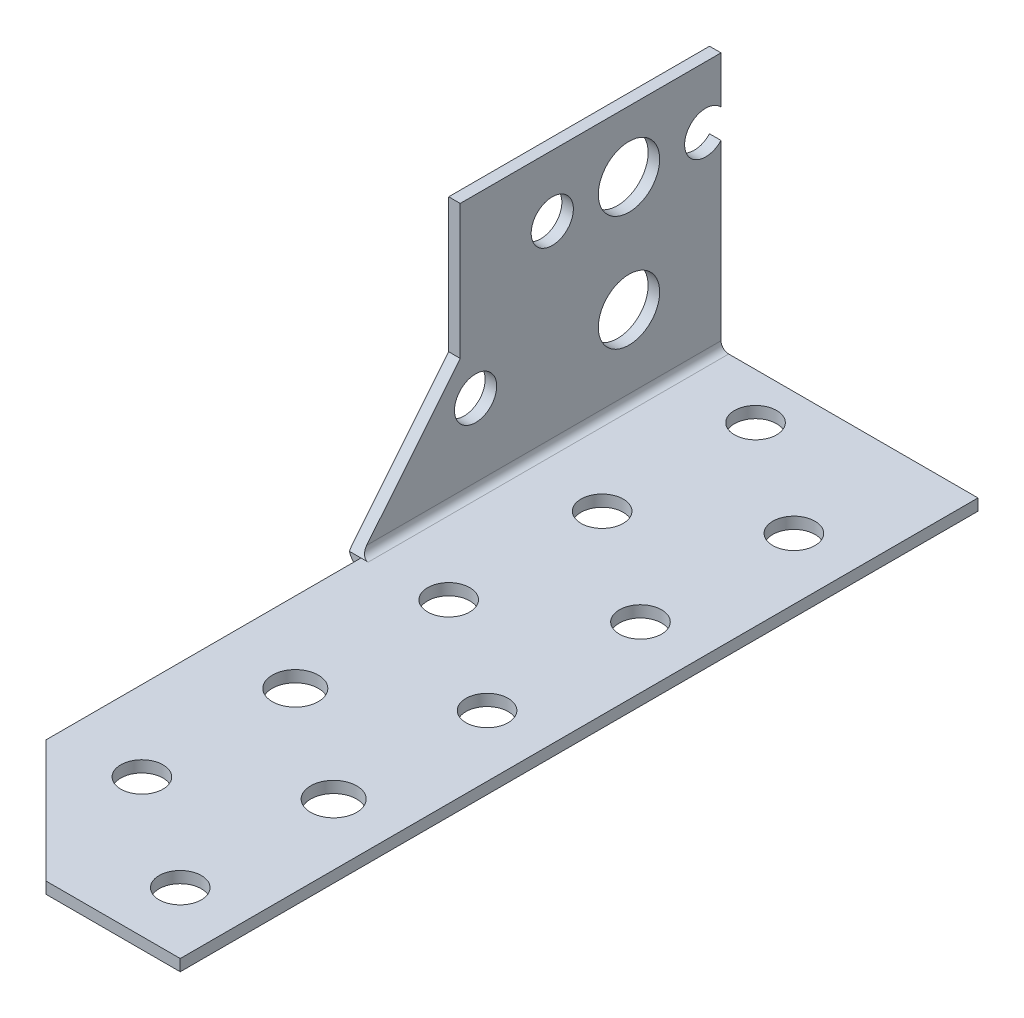
ISO-10303-21;
HEADER;
FILE_DESCRIPTION(('STEP AP214'),'2;1');
FILE_NAME('part.step','',(''),(''),'','','');
FILE_SCHEMA(('AUTOMOTIVE_DESIGN { 1 0 10303 214 1 1 1 1 }'));
ENDSEC;
DATA;
#1=APPLICATION_CONTEXT('core data for automotive mechanical design processes');
#2=APPLICATION_PROTOCOL_DEFINITION('international standard','automotive_design',2000,#1);
#3=PRODUCT_CONTEXT('',#1,'mechanical');
#4=PRODUCT('Part','Part','',(#3));
#5=PRODUCT_RELATED_PRODUCT_CATEGORY('part','',(#4));
#6=PRODUCT_DEFINITION_FORMATION('','',#4);
#7=PRODUCT_DEFINITION_CONTEXT('part definition',#1,'design');
#8=PRODUCT_DEFINITION('design','',#6,#7);
#9=PRODUCT_DEFINITION_SHAPE('','',#8);
#10=(LENGTH_UNIT() NAMED_UNIT(*) SI_UNIT(.MILLI.,.METRE.));
#11=(NAMED_UNIT(*) PLANE_ANGLE_UNIT() SI_UNIT($,.RADIAN.));
#12=(NAMED_UNIT(*) SI_UNIT($,.STERADIAN.) SOLID_ANGLE_UNIT());
#13=UNCERTAINTY_MEASURE_WITH_UNIT(LENGTH_MEASURE(1.E-05),#10,'distance_accuracy_value','');
#14=(GEOMETRIC_REPRESENTATION_CONTEXT(3) GLOBAL_UNCERTAINTY_ASSIGNED_CONTEXT((#13)) GLOBAL_UNIT_ASSIGNED_CONTEXT((#10,
#11,#12)) REPRESENTATION_CONTEXT('',''));
#15=CARTESIAN_POINT('',(0.,0.,0.));
#16=DIRECTION('',(0.,0.,1.));
#17=DIRECTION('',(1.,0.,0.));
#18=AXIS2_PLACEMENT_3D('',#15,#16,#17);
#19=CARTESIAN_POINT('',(0.,0.,210.));
#20=DIRECTION('',(0.,0.,1.));
#21=DIRECTION('',(1.,0.,0.));
#22=AXIS2_PLACEMENT_3D('',#19,#20,#21);
#23=PLANE('',#22);
#24=DIRECTION('',(0.,1.,0.));
#25=VECTOR('',#24,1.);
#26=CARTESIAN_POINT('',(16.75,0.,210.));
#27=LINE('',#26,#25);
#28=CARTESIAN_POINT('',(16.75,-17.5,210.));
#29=VERTEX_POINT('',#28);
#30=CARTESIAN_POINT('',(16.75,-16.,210.));
#31=VERTEX_POINT('',#30);
#32=EDGE_CURVE('E193',#29,#31,#27,.T.);
#33=ORIENTED_EDGE('',*,*,#32,.F.);
#34=DIRECTION('',(1.,0.,0.));
#35=VECTOR('',#34,1.);
#36=CARTESIAN_POINT('',(0.,-17.5,210.));
#37=LINE('',#36,#35);
#38=CARTESIAN_POINT('',(34.25,-17.5,210.));
#39=VERTEX_POINT('',#38);
#40=EDGE_CURVE('E411',#29,#39,#37,.T.);
#41=ORIENTED_EDGE('',*,*,#40,.T.);
#42=DIRECTION('',(0.,1.,0.));
#43=VECTOR('',#42,1.);
#44=CARTESIAN_POINT('',(34.2500000000001,-1.58438077472549E-13,210.));
#45=LINE('',#44,#43);
#46=CARTESIAN_POINT('',(34.25,-16.,210.));
#47=VERTEX_POINT('',#46);
#48=EDGE_CURVE('E414',#39,#47,#45,.T.);
#49=ORIENTED_EDGE('',*,*,#48,.T.);
#50=DIRECTION('',(1.,0.,0.));
#51=VECTOR('',#50,1.);
#52=CARTESIAN_POINT('',(0.,-16.,210.));
#53=LINE('',#52,#51);
#54=EDGE_CURVE('E176',#31,#47,#53,.T.);
#55=ORIENTED_EDGE('',*,*,#54,.F.);
#56=EDGE_LOOP('',(#33,#41,#49,#55));
#57=FACE_BOUND('',#56,.T.);
#58=ADVANCED_FACE('F46',(#57),#23,.T.);
#59=CARTESIAN_POINT('',(26.25,-21.,202.));
#60=DIRECTION('',(0.,1.,0.));
#61=DIRECTION('',(0.,0.,1.));
#62=AXIS2_PLACEMENT_3D('',#59,#60,#61);
#63=CYLINDRICAL_SURFACE('',#62,2.75000000000002);
#64=CARTESIAN_POINT('',(26.25,-16.,202.));
#65=DIRECTION('',(0.,1.,0.));
#66=DIRECTION('',(0.,0.,1.));
#67=AXIS2_PLACEMENT_3D('',#64,#65,#66);
#68=CIRCLE('',#67,2.75000000000002);
#69=CARTESIAN_POINT('',(26.25,-16.,204.75));
#70=VERTEX_POINT('',#69);
#71=EDGE_CURVE('E279',#70,#70,#68,.T.);
#72=ORIENTED_EDGE('',*,*,#71,.T.);
#73=EDGE_LOOP('',(#72));
#74=FACE_BOUND('',#73,.T.);
#75=CARTESIAN_POINT('',(26.25,-17.5,202.));
#76=DIRECTION('',(0.,1.,0.));
#77=DIRECTION('',(0.,0.,1.));
#78=AXIS2_PLACEMENT_3D('',#75,#76,#77);
#79=CIRCLE('',#78,2.75000000000002);
#80=CARTESIAN_POINT('',(26.25,-17.5,204.75));
#81=VERTEX_POINT('',#80);
#82=EDGE_CURVE('E339',#81,#81,#79,.T.);
#83=ORIENTED_EDGE('',*,*,#82,.F.);
#84=EDGE_LOOP('',(#83));
#85=FACE_BOUND('',#84,.T.);
#86=ADVANCED_FACE('F482',(#74,#85),#63,.F.);
#87=CARTESIAN_POINT('',(26.25,-21.,162.));
#88=DIRECTION('',(0.,1.,0.));
#89=DIRECTION('',(0.,0.,1.));
#90=AXIS2_PLACEMENT_3D('',#87,#88,#89);
#91=CYLINDRICAL_SURFACE('',#90,2.75000000000002);
#92=CARTESIAN_POINT('',(26.25,-16.,162.));
#93=DIRECTION('',(0.,1.,0.));
#94=DIRECTION('',(0.,0.,1.));
#95=AXIS2_PLACEMENT_3D('',#92,#93,#94);
#96=CIRCLE('',#95,2.75000000000002);
#97=CARTESIAN_POINT('',(26.25,-16.,164.75));
#98=VERTEX_POINT('',#97);
#99=EDGE_CURVE('E289',#98,#98,#96,.T.);
#100=ORIENTED_EDGE('',*,*,#99,.T.);
#101=EDGE_LOOP('',(#100));
#102=FACE_BOUND('',#101,.T.);
#103=CARTESIAN_POINT('',(26.25,-17.5,162.));
#104=DIRECTION('',(0.,1.,0.));
#105=DIRECTION('',(0.,0.,1.));
#106=AXIS2_PLACEMENT_3D('',#103,#104,#105);
#107=CIRCLE('',#106,2.75000000000002);
#108=CARTESIAN_POINT('',(26.25,-17.5,164.75));
#109=VERTEX_POINT('',#108);
#110=EDGE_CURVE('E335',#109,#109,#107,.T.);
#111=ORIENTED_EDGE('',*,*,#110,.F.);
#112=EDGE_LOOP('',(#111));
#113=FACE_BOUND('',#112,.T.);
#114=ADVANCED_FACE('F488',(#102,#113),#91,.F.);
#115=CARTESIAN_POINT('',(26.25,-21.,142.));
#116=DIRECTION('',(0.,1.,0.));
#117=DIRECTION('',(0.,0.,1.));
#118=AXIS2_PLACEMENT_3D('',#115,#116,#117);
#119=CYLINDRICAL_SURFACE('',#118,2.75000000000001);
#120=CARTESIAN_POINT('',(26.25,-16.,142.));
#121=DIRECTION('',(0.,1.,0.));
#122=DIRECTION('',(0.,0.,1.));
#123=AXIS2_PLACEMENT_3D('',#120,#121,#122);
#124=CIRCLE('',#123,2.75000000000001);
#125=CARTESIAN_POINT('',(26.25,-16.,144.75));
#126=VERTEX_POINT('',#125);
#127=EDGE_CURVE('E285',#126,#126,#124,.T.);
#128=ORIENTED_EDGE('',*,*,#127,.T.);
#129=EDGE_LOOP('',(#128));
#130=FACE_BOUND('',#129,.T.);
#131=CARTESIAN_POINT('',(26.25,-17.5,142.));
#132=DIRECTION('',(0.,1.,0.));
#133=DIRECTION('',(0.,0.,1.));
#134=AXIS2_PLACEMENT_3D('',#131,#132,#133);
#135=CIRCLE('',#134,2.75000000000001);
#136=CARTESIAN_POINT('',(26.25,-17.5,144.75));
#137=VERTEX_POINT('',#136);
#138=EDGE_CURVE('E331',#137,#137,#135,.T.);
#139=ORIENTED_EDGE('',*,*,#138,.F.);
#140=EDGE_LOOP('',(#139));
#141=FACE_BOUND('',#140,.T.);
#142=ADVANCED_FACE('F605',(#130,#141),#119,.F.);
#143=CARTESIAN_POINT('',(26.25,-21.,122.));
#144=DIRECTION('',(0.,1.,0.));
#145=DIRECTION('',(0.,0.,1.));
#146=AXIS2_PLACEMENT_3D('',#143,#144,#145);
#147=CYLINDRICAL_SURFACE('',#146,2.74999999999999);
#148=CARTESIAN_POINT('',(26.25,-16.,122.));
#149=DIRECTION('',(0.,1.,0.));
#150=DIRECTION('',(0.,0.,1.));
#151=AXIS2_PLACEMENT_3D('',#148,#149,#150);
#152=CIRCLE('',#151,2.74999999999999);
#153=CARTESIAN_POINT('',(26.25,-16.,124.75));
#154=VERTEX_POINT('',#153);
#155=EDGE_CURVE('E280',#154,#154,#152,.T.);
#156=ORIENTED_EDGE('',*,*,#155,.T.);
#157=EDGE_LOOP('',(#156));
#158=FACE_BOUND('',#157,.T.);
#159=CARTESIAN_POINT('',(26.25,-17.5,122.));
#160=DIRECTION('',(0.,1.,0.));
#161=DIRECTION('',(0.,0.,1.));
#162=AXIS2_PLACEMENT_3D('',#159,#160,#161);
#163=CIRCLE('',#162,2.74999999999999);
#164=CARTESIAN_POINT('',(26.25,-17.5,124.75));
#165=VERTEX_POINT('',#164);
#166=EDGE_CURVE('E327',#165,#165,#163,.T.);
#167=ORIENTED_EDGE('',*,*,#166,.F.);
#168=EDGE_LOOP('',(#167));
#169=FACE_BOUND('',#168,.T.);
#170=ADVANCED_FACE('F578',(#158,#169),#147,.F.);
#171=CARTESIAN_POINT('',(11.25,-21.,112.));
#172=DIRECTION('',(0.,1.,0.));
#173=DIRECTION('',(0.,0.,1.));
#174=AXIS2_PLACEMENT_3D('',#171,#172,#173);
#175=CYLINDRICAL_SURFACE('',#174,2.74999999999997);
#176=CARTESIAN_POINT('',(11.25,-16.,112.));
#177=DIRECTION('',(0.,1.,0.));
#178=DIRECTION('',(0.,0.,1.));
#179=AXIS2_PLACEMENT_3D('',#176,#177,#178);
#180=CIRCLE('',#179,2.74999999999997);
#181=CARTESIAN_POINT('',(11.25,-16.,114.75));
#182=VERTEX_POINT('',#181);
#183=EDGE_CURVE('E300',#182,#182,#180,.T.);
#184=ORIENTED_EDGE('',*,*,#183,.T.);
#185=EDGE_LOOP('',(#184));
#186=FACE_BOUND('',#185,.T.);
#187=CARTESIAN_POINT('',(11.25,-17.5,112.));
#188=DIRECTION('',(0.,1.,0.));
#189=DIRECTION('',(0.,0.,1.));
#190=AXIS2_PLACEMENT_3D('',#187,#188,#189);
#191=CIRCLE('',#190,2.74999999999997);
#192=CARTESIAN_POINT('',(11.25,-17.5,114.75));
#193=VERTEX_POINT('',#192);
#194=EDGE_CURVE('E323',#193,#193,#191,.T.);
#195=ORIENTED_EDGE('',*,*,#194,.F.);
#196=EDGE_LOOP('',(#195));
#197=FACE_BOUND('',#196,.T.);
#198=ADVANCED_FACE('F573',(#186,#197),#175,.F.);
#199=CARTESIAN_POINT('',(11.25,-21.,132.));
#200=DIRECTION('',(0.,1.,0.));
#201=DIRECTION('',(0.,0.,1.));
#202=AXIS2_PLACEMENT_3D('',#199,#200,#201);
#203=CYLINDRICAL_SURFACE('',#202,2.75000000000001);
#204=CARTESIAN_POINT('',(11.25,-16.,132.));
#205=DIRECTION('',(0.,1.,0.));
#206=DIRECTION('',(0.,0.,1.));
#207=AXIS2_PLACEMENT_3D('',#204,#205,#206);
#208=CIRCLE('',#207,2.75000000000001);
#209=CARTESIAN_POINT('',(11.25,-16.,134.75));
#210=VERTEX_POINT('',#209);
#211=EDGE_CURVE('E305',#210,#210,#208,.T.);
#212=ORIENTED_EDGE('',*,*,#211,.T.);
#213=EDGE_LOOP('',(#212));
#214=FACE_BOUND('',#213,.T.);
#215=CARTESIAN_POINT('',(11.25,-17.5,132.));
#216=DIRECTION('',(0.,1.,0.));
#217=DIRECTION('',(0.,0.,1.));
#218=AXIS2_PLACEMENT_3D('',#215,#216,#217);
#219=CIRCLE('',#218,2.75000000000001);
#220=CARTESIAN_POINT('',(11.25,-17.5,134.75));
#221=VERTEX_POINT('',#220);
#222=EDGE_CURVE('E319',#221,#221,#219,.T.);
#223=ORIENTED_EDGE('',*,*,#222,.F.);
#224=EDGE_LOOP('',(#223));
#225=FACE_BOUND('',#224,.T.);
#226=ADVANCED_FACE('F577',(#214,#225),#203,.F.);
#227=CARTESIAN_POINT('',(11.25,-21.,152.));
#228=DIRECTION('',(0.,1.,0.));
#229=DIRECTION('',(0.,0.,1.));
#230=AXIS2_PLACEMENT_3D('',#227,#228,#229);
#231=CYLINDRICAL_SURFACE('',#230,2.75000000000001);
#232=CARTESIAN_POINT('',(11.25,-16.,152.));
#233=DIRECTION('',(0.,1.,0.));
#234=DIRECTION('',(0.,0.,1.));
#235=AXIS2_PLACEMENT_3D('',#232,#233,#234);
#236=CIRCLE('',#235,2.75000000000001);
#237=CARTESIAN_POINT('',(11.25,-16.,154.75));
#238=VERTEX_POINT('',#237);
#239=EDGE_CURVE('E299',#238,#238,#236,.T.);
#240=ORIENTED_EDGE('',*,*,#239,.T.);
#241=EDGE_LOOP('',(#240));
#242=FACE_BOUND('',#241,.T.);
#243=CARTESIAN_POINT('',(11.25,-17.5,152.));
#244=DIRECTION('',(0.,1.,0.));
#245=DIRECTION('',(0.,0.,1.));
#246=AXIS2_PLACEMENT_3D('',#243,#244,#245);
#247=CIRCLE('',#246,2.75000000000001);
#248=CARTESIAN_POINT('',(11.25,-17.5,154.75));
#249=VERTEX_POINT('',#248);
#250=EDGE_CURVE('E315',#249,#249,#247,.T.);
#251=ORIENTED_EDGE('',*,*,#250,.F.);
#252=EDGE_LOOP('',(#251));
#253=FACE_BOUND('',#252,.T.);
#254=ADVANCED_FACE('F565',(#242,#253),#231,.F.);
#255=CARTESIAN_POINT('',(11.25,-21.,192.));
#256=DIRECTION('',(0.,1.,0.));
#257=DIRECTION('',(0.,0.,1.));
#258=AXIS2_PLACEMENT_3D('',#255,#256,#257);
#259=CYLINDRICAL_SURFACE('',#258,2.75000000000002);
#260=CARTESIAN_POINT('',(11.25,-16.,192.));
#261=DIRECTION('',(0.,1.,0.));
#262=DIRECTION('',(0.,0.,1.));
#263=AXIS2_PLACEMENT_3D('',#260,#261,#262);
#264=CIRCLE('',#263,2.75000000000002);
#265=CARTESIAN_POINT('',(11.25,-16.,194.75));
#266=VERTEX_POINT('',#265);
#267=EDGE_CURVE('E284',#266,#266,#264,.T.);
#268=ORIENTED_EDGE('',*,*,#267,.T.);
#269=EDGE_LOOP('',(#268));
#270=FACE_BOUND('',#269,.T.);
#271=CARTESIAN_POINT('',(11.25,-17.5,192.));
#272=DIRECTION('',(0.,1.,0.));
#273=DIRECTION('',(0.,0.,1.));
#274=AXIS2_PLACEMENT_3D('',#271,#272,#273);
#275=CIRCLE('',#274,2.75000000000002);
#276=CARTESIAN_POINT('',(11.25,-17.5,194.75));
#277=VERTEX_POINT('',#276);
#278=EDGE_CURVE('E304',#277,#277,#275,.T.);
#279=ORIENTED_EDGE('',*,*,#278,.F.);
#280=EDGE_LOOP('',(#279));
#281=FACE_BOUND('',#280,.T.);
#282=ADVANCED_FACE('F556',(#270,#281),#259,.F.);
#283=CARTESIAN_POINT('',(-4.25,-5.5,138.));
#284=DIRECTION('',(1.,0.,0.));
#285=DIRECTION('',(0.,1.,0.));
#286=AXIS2_PLACEMENT_3D('',#283,#284,#285);
#287=CYLINDRICAL_SURFACE('',#286,2.75000000000001);
#288=CARTESIAN_POINT('',(0.750000000000001,-5.5,138.));
#289=DIRECTION('',(1.,0.,0.));
#290=DIRECTION('',(0.,1.,0.));
#291=AXIS2_PLACEMENT_3D('',#288,#289,#290);
#292=CIRCLE('',#291,2.75000000000001);
#293=CARTESIAN_POINT('',(0.75,-2.74999999999999,138.));
#294=VERTEX_POINT('',#293);
#295=EDGE_CURVE('E357',#294,#294,#292,.T.);
#296=ORIENTED_EDGE('',*,*,#295,.T.);
#297=EDGE_LOOP('',(#296));
#298=FACE_BOUND('',#297,.T.);
#299=CARTESIAN_POINT('',(-0.749999999999999,-5.5,138.));
#300=DIRECTION('',(1.,0.,0.));
#301=DIRECTION('',(0.,1.,0.));
#302=AXIS2_PLACEMENT_3D('',#299,#300,#301);
#303=CIRCLE('',#302,2.75000000000001);
#304=CARTESIAN_POINT('',(-0.749999999999999,-2.74999999999999,138.));
#305=VERTEX_POINT('',#304);
#306=EDGE_CURVE('E377',#305,#305,#303,.T.);
#307=ORIENTED_EDGE('',*,*,#306,.F.);
#308=EDGE_LOOP('',(#307));
#309=FACE_BOUND('',#308,.T.);
#310=ADVANCED_FACE('F520',(#298,#309),#287,.F.);
#311=CARTESIAN_POINT('',(-4.25,9.49999999999999,128.));
#312=DIRECTION('',(1.,0.,0.));
#313=DIRECTION('',(0.,1.,0.));
#314=AXIS2_PLACEMENT_3D('',#311,#312,#313);
#315=CYLINDRICAL_SURFACE('',#314,2.75000000000001);
#316=CARTESIAN_POINT('',(0.749999999999999,9.49999999999999,128.));
#317=DIRECTION('',(1.,0.,0.));
#318=DIRECTION('',(0.,1.,0.));
#319=AXIS2_PLACEMENT_3D('',#316,#317,#318);
#320=CIRCLE('',#319,2.75000000000001);
#321=CARTESIAN_POINT('',(0.749999999999999,12.25,128.));
#322=VERTEX_POINT('',#321);
#323=EDGE_CURVE('E361',#322,#322,#320,.T.);
#324=ORIENTED_EDGE('',*,*,#323,.T.);
#325=EDGE_LOOP('',(#324));
#326=FACE_BOUND('',#325,.T.);
#327=CARTESIAN_POINT('',(-0.750000000000001,9.49999999999999,128.));
#328=DIRECTION('',(1.,0.,0.));
#329=DIRECTION('',(0.,1.,0.));
#330=AXIS2_PLACEMENT_3D('',#327,#328,#329);
#331=CIRCLE('',#330,2.75000000000001);
#332=CARTESIAN_POINT('',(-0.750000000000002,12.25,128.));
#333=VERTEX_POINT('',#332);
#334=EDGE_CURVE('E366',#333,#333,#331,.T.);
#335=ORIENTED_EDGE('',*,*,#334,.F.);
#336=EDGE_LOOP('',(#335));
#337=FACE_BOUND('',#336,.T.);
#338=ADVANCED_FACE('F521',(#326,#337),#315,.F.);
#339=CARTESIAN_POINT('',(62.75,17.5,140.));
#340=DIRECTION('',(0.,0.,1.));
#341=DIRECTION('',(1.,0.,0.));
#342=AXIS2_PLACEMENT_3D('',#339,#340,#341);
#343=PLANE('',#342);
#344=DIRECTION('',(0.,-1.,0.));
#345=VECTOR('',#344,1.);
#346=CARTESIAN_POINT('',(-0.75,0.,140.));
#347=LINE('',#346,#345);
#348=CARTESIAN_POINT('',(-0.750000000000001,17.5,140.));
#349=VERTEX_POINT('',#348);
#350=CARTESIAN_POINT('',(-0.750000000000001,0.,140.));
#351=VERTEX_POINT('',#350);
#352=EDGE_CURVE('E404',#349,#351,#347,.T.);
#353=ORIENTED_EDGE('',*,*,#352,.T.);
#354=DIRECTION('',(-1.,0.,0.));
#355=VECTOR('',#354,1.);
#356=CARTESIAN_POINT('',(62.75,0.,140.));
#357=LINE('',#356,#355);
#358=CARTESIAN_POINT('',(0.750000000000001,0.,140.));
#359=VERTEX_POINT('',#358);
#360=EDGE_CURVE('E392',#359,#351,#357,.T.);
#361=ORIENTED_EDGE('',*,*,#360,.F.);
#362=DIRECTION('',(0.,-1.,0.));
#363=VECTOR('',#362,1.);
#364=CARTESIAN_POINT('',(0.75,0.,140.));
#365=LINE('',#364,#363);
#366=CARTESIAN_POINT('',(0.750000000000001,17.5,140.));
#367=VERTEX_POINT('',#366);
#368=EDGE_CURVE('E400',#367,#359,#365,.T.);
#369=ORIENTED_EDGE('',*,*,#368,.F.);
#370=DIRECTION('',(-1.,0.,0.));
#371=VECTOR('',#370,1.);
#372=CARTESIAN_POINT('',(62.75,17.5,140.));
#373=LINE('',#372,#371);
#374=EDGE_CURVE('E389',#367,#349,#373,.T.);
#375=ORIENTED_EDGE('',*,*,#374,.T.);
#376=EDGE_LOOP('',(#353,#361,#369,#375));
#377=FACE_BOUND('',#376,.T.);
#378=ADVANCED_FACE('F453',(#377),#343,.T.);
#379=CARTESIAN_POINT('',(62.75,-16.,153.));
#380=DIRECTION('',(0.,0.630592625094465,0.776114000116266));
#381=DIRECTION('',(0.,-0.776114000116266,0.630592625094465));
#382=AXIS2_PLACEMENT_3D('',#379,#380,#381);
#383=PLANE('',#382);
#384=DIRECTION('',(0.,-0.776114000116266,0.630592625094465));
#385=VECTOR('',#384,1.);
#386=CARTESIAN_POINT('',(-0.749999999999995,-34.2588235294117,167.835294117647));
#387=LINE('',#386,#385);
#388=CARTESIAN_POINT('',(-0.749999999999997,-15.5,152.59375));
#389=VERTEX_POINT('',#388);
#390=EDGE_CURVE('E407',#351,#389,#387,.T.);
#391=ORIENTED_EDGE('',*,*,#390,.T.);
#392=CARTESIAN_POINT('',(1.25,-15.5,152.59375));
#393=DIRECTION('',(0.,0.630592625094465,0.776114000116266));
#394=DIRECTION('',(0.,0.776114000116266,-0.630592625094465));
#395=AXIS2_PLACEMENT_3D('',#392,#393,#394);
#396=ELLIPSE('',#395,2.57694101601104,2.);
#397=CARTESIAN_POINT('',(-0.686491673103709,-16.,153.));
#398=VERTEX_POINT('',#397);
#399=EDGE_CURVE('E213',#389,#398,#396,.T.);
#400=ORIENTED_EDGE('',*,*,#399,.T.);
#401=DIRECTION('',(-1.,0.,0.));
#402=VECTOR('',#401,1.);
#403=CARTESIAN_POINT('',(-0.686491673103709,-16.,153.));
#404=LINE('',#403,#402);
#405=CARTESIAN_POINT('',(0.813508326896291,-16.,153.));
#406=VERTEX_POINT('',#405);
#407=EDGE_CURVE('E347',#406,#398,#404,.T.);
#408=ORIENTED_EDGE('',*,*,#407,.F.);
#409=DIRECTION('',(-1.,0.,0.));
#410=VECTOR('',#409,1.);
#411=CARTESIAN_POINT('',(62.75,-16.,153.));
#412=LINE('',#411,#410);
#413=CARTESIAN_POINT('',(1.75,-16.,153.));
#414=VERTEX_POINT('',#413);
#415=EDGE_CURVE('E396',#414,#406,#412,.T.);
#416=ORIENTED_EDGE('',*,*,#415,.F.);
#417=CARTESIAN_POINT('',(1.75,-15.,152.1875));
#418=DIRECTION('',(0.,0.630592625094465,0.776114000116266));
#419=DIRECTION('',(0.,-0.776114000116266,0.630592625094465));
#420=AXIS2_PLACEMENT_3D('',#417,#418,#419);
#421=ELLIPSE('',#420,1.28847050800552,1.);
#422=CARTESIAN_POINT('',(0.750000000000002,-15.,152.1875));
#423=VERTEX_POINT('',#422);
#424=EDGE_CURVE('E203',#414,#423,#421,.F.);
#425=ORIENTED_EDGE('',*,*,#424,.T.);
#426=DIRECTION('',(0.,-0.776114000116266,0.630592625094465));
#427=VECTOR('',#426,1.);
#428=CARTESIAN_POINT('',(0.750000000000004,-34.2588235294117,167.835294117647));
#429=LINE('',#428,#427);
#430=EDGE_CURVE('E183',#359,#423,#429,.T.);
#431=ORIENTED_EDGE('',*,*,#430,.F.);
#432=ORIENTED_EDGE('',*,*,#360,.T.);
#433=EDGE_LOOP('',(#391,#400,#408,#416,#425,#431,#432));
#434=FACE_BOUND('',#433,.T.);
#435=ADVANCED_FACE('F449',(#434),#383,.T.);
#436=CARTESIAN_POINT('',(-0.686491673103709,-21.,153.));
#437=DIRECTION('',(0.,0.,-1.));
#438=DIRECTION('',(-1.,0.,0.));
#439=AXIS2_PLACEMENT_3D('',#436,#437,#438);
#440=PLANE('',#439);
#441=CARTESIAN_POINT('',(1.25,-15.5,153.));
#442=DIRECTION('',(0.,0.,-1.));
#443=DIRECTION('',(-1.,0.,0.));
#444=AXIS2_PLACEMENT_3D('',#441,#442,#443);
#445=CIRCLE('',#444,2.);
#446=CARTESIAN_POINT('',(0.813508326896298,-17.4517876470844,153.));
#447=VERTEX_POINT('',#446);
#448=EDGE_CURVE('E56',#398,#447,#445,.F.);
#449=ORIENTED_EDGE('',*,*,#448,.T.);
#450=DIRECTION('',(0.,1.,0.));
#451=VECTOR('',#450,1.);
#452=CARTESIAN_POINT('',(0.813508326896291,-21.,153.));
#453=LINE('',#452,#451);
#454=EDGE_CURVE('E350',#447,#406,#453,.T.);
#455=ORIENTED_EDGE('',*,*,#454,.T.);
#456=ORIENTED_EDGE('',*,*,#407,.T.);
#457=EDGE_LOOP('',(#449,#455,#456));
#458=FACE_BOUND('',#457,.T.);
#459=ADVANCED_FACE('F470',(#458),#440,.F.);
#460=CARTESIAN_POINT('',(0.813508326896291,-21.,153.));
#461=DIRECTION('',(1.,0.,0.));
#462=DIRECTION('',(0.,0.,-1.));
#463=AXIS2_PLACEMENT_3D('',#460,#461,#462);
#464=PLANE('',#463);
#465=DIRECTION('',(0.,0.,-1.));
#466=VECTOR('',#465,1.);
#467=CARTESIAN_POINT('',(0.813508326896291,-16.,153.));
#468=LINE('',#467,#466);
#469=CARTESIAN_POINT('',(0.813508326896292,-16.,194.063508326896));
#470=VERTEX_POINT('',#469);
#471=EDGE_CURVE('E343',#470,#406,#468,.T.);
#472=ORIENTED_EDGE('',*,*,#471,.T.);
#473=ORIENTED_EDGE('',*,*,#454,.F.);
#474=DIRECTION('',(0.,0.,-1.));
#475=VECTOR('',#474,1.);
#476=CARTESIAN_POINT('',(0.813508326896298,-17.4517876470844,210.));
#477=LINE('',#476,#475);
#478=CARTESIAN_POINT('',(0.813508326896298,-17.4517876470844,194.063508326896));
#479=VERTEX_POINT('',#478);
#480=EDGE_CURVE('E220',#447,#479,#477,.F.);
#481=ORIENTED_EDGE('',*,*,#480,.T.);
#482=DIRECTION('',(0.,-1.,0.));
#483=VECTOR('',#482,1.);
#484=CARTESIAN_POINT('',(0.813508326896296,-78.,194.063508326896));
#485=LINE('',#484,#483);
#486=EDGE_CURVE('E353',#470,#479,#485,.T.);
#487=ORIENTED_EDGE('',*,*,#486,.F.);
#488=EDGE_LOOP('',(#472,#473,#481,#487));
#489=FACE_BOUND('',#488,.T.);
#490=ADVANCED_FACE('F468',(#489),#464,.F.);
#491=CARTESIAN_POINT('',(16.75,-78.,210.));
#492=DIRECTION('',(0.707106781186547,0.,-0.707106781186548));
#493=DIRECTION('',(-0.707106781186548,0.,-0.707106781186547));
#494=AXIS2_PLACEMENT_3D('',#491,#492,#493);
#495=PLANE('',#494);
#496=DIRECTION('',(-0.707106781186548,0.,-0.707106781186547));
#497=VECTOR('',#496,1.);
#498=CARTESIAN_POINT('',(16.75,-16.,210.));
#499=LINE('',#498,#497);
#500=EDGE_CURVE('E381',#31,#470,#499,.T.);
#501=ORIENTED_EDGE('',*,*,#500,.T.);
#502=ORIENTED_EDGE('',*,*,#486,.T.);
#503=CARTESIAN_POINT('',(1.25,-15.5,194.5));
#504=DIRECTION('',(0.707106781186547,0.,-0.707106781186548));
#505=DIRECTION('',(-0.707106781186548,0.,-0.707106781186547));
#506=AXIS2_PLACEMENT_3D('',#503,#504,#505);
#507=ELLIPSE('',#506,2.82842712474619,2.);
#508=CARTESIAN_POINT('',(1.25,-17.5,194.5));
#509=VERTEX_POINT('',#508);
#510=EDGE_CURVE('E217',#479,#509,#507,.F.);
#511=ORIENTED_EDGE('',*,*,#510,.T.);
#512=DIRECTION('',(-0.707106781186548,0.,-0.707106781186547));
#513=VECTOR('',#512,1.);
#514=CARTESIAN_POINT('',(8.37499999999999,-17.5,201.625));
#515=LINE('',#514,#513);
#516=EDGE_CURVE('E385',#29,#509,#515,.T.);
#517=ORIENTED_EDGE('',*,*,#516,.F.);
#518=ORIENTED_EDGE('',*,*,#32,.T.);
#519=EDGE_LOOP('',(#501,#502,#511,#517,#518));
#520=FACE_BOUND('',#519,.T.);
#521=ADVANCED_FACE('F461',(#520),#495,.F.);
#522=CARTESIAN_POINT('',(1.25,-15.5,210.));
#523=DIRECTION('',(0.,0.,-1.));
#524=DIRECTION('',(-1.,0.,0.));
#525=AXIS2_PLACEMENT_3D('',#522,#523,#524);
#526=CYLINDRICAL_SURFACE('',#525,2.);
#527=DIRECTION('',(0.,0.,-1.));
#528=VECTOR('',#527,1.);
#529=CARTESIAN_POINT('',(-0.749999999999997,-15.5,210.));
#530=LINE('',#529,#528);
#531=CARTESIAN_POINT('',(-0.749999999999997,-15.5,106.));
#532=VERTEX_POINT('',#531);
#533=EDGE_CURVE('E210',#532,#389,#530,.F.);
#534=ORIENTED_EDGE('',*,*,#533,.F.);
#535=CARTESIAN_POINT('',(1.25,-15.5,106.));
#536=DIRECTION('',(0.,0.,-1.));
#537=DIRECTION('',(-1.,0.,0.));
#538=AXIS2_PLACEMENT_3D('',#535,#536,#537);
#539=CIRCLE('',#538,2.);
#540=CARTESIAN_POINT('',(1.25,-17.5,106.));
#541=VERTEX_POINT('',#540);
#542=EDGE_CURVE('E11',#532,#541,#539,.F.);
#543=ORIENTED_EDGE('',*,*,#542,.T.);
#544=DIRECTION('',(0.,0.,-1.));
#545=VECTOR('',#544,1.);
#546=CARTESIAN_POINT('',(1.25,-17.5,210.));
#547=LINE('',#546,#545);
#548=EDGE_CURVE('E206',#509,#541,#547,.T.);
#549=ORIENTED_EDGE('',*,*,#548,.F.);
#550=ORIENTED_EDGE('',*,*,#510,.F.);
#551=ORIENTED_EDGE('',*,*,#480,.F.);
#552=ORIENTED_EDGE('',*,*,#448,.F.);
#553=ORIENTED_EDGE('',*,*,#399,.F.);
#554=EDGE_LOOP('',(#534,#543,#549,#550,#551,#552,#553));
#555=FACE_BOUND('',#554,.T.);
#556=ADVANCED_FACE('F48',(#555),#526,.T.);
#557=CARTESIAN_POINT('',(0.,17.5,210.));
#558=DIRECTION('',(0.,1.,0.));
#559=DIRECTION('',(0.,0.,1.));
#560=AXIS2_PLACEMENT_3D('',#557,#558,#559);
#561=PLANE('',#560);
#562=DIRECTION('',(0.,0.,-1.));
#563=VECTOR('',#562,1.);
#564=CARTESIAN_POINT('',(0.749999999999998,17.5,210.));
#565=LINE('',#564,#563);
#566=CARTESIAN_POINT('',(0.749999999999998,17.5,106.));
#567=VERTEX_POINT('',#566);
#568=EDGE_CURVE('E179',#367,#567,#565,.T.);
#569=ORIENTED_EDGE('',*,*,#568,.T.);
#570=DIRECTION('',(-1.,0.,0.));
#571=VECTOR('',#570,1.);
#572=CARTESIAN_POINT('',(0.,17.5,106.));
#573=LINE('',#572,#571);
#574=CARTESIAN_POINT('',(-0.750000000000002,17.5,106.));
#575=VERTEX_POINT('',#574);
#576=EDGE_CURVE('E275',#567,#575,#573,.T.);
#577=ORIENTED_EDGE('',*,*,#576,.T.);
#578=DIRECTION('',(0.,0.,-1.));
#579=VECTOR('',#578,1.);
#580=CARTESIAN_POINT('',(-0.750000000000002,17.5,210.));
#581=LINE('',#580,#579);
#582=EDGE_CURVE('E186',#349,#575,#581,.T.);
#583=ORIENTED_EDGE('',*,*,#582,.F.);
#584=ORIENTED_EDGE('',*,*,#374,.F.);
#585=EDGE_LOOP('',(#569,#577,#583,#584));
#586=FACE_BOUND('',#585,.T.);
#587=ADVANCED_FACE('F430',(#586),#561,.T.);
#588=CARTESIAN_POINT('',(-4.25,9.49999999999999,108.));
#589=DIRECTION('',(1.,0.,0.));
#590=DIRECTION('',(0.,1.,0.));
#591=AXIS2_PLACEMENT_3D('',#588,#589,#590);
#592=CYLINDRICAL_SURFACE('',#591,2.75000000000001);
#593=DIRECTION('',(1.,0.,0.));
#594=VECTOR('',#593,1.);
#595=CARTESIAN_POINT('',(-4.25,11.3874586088177,106.));
#596=LINE('',#595,#594);
#597=CARTESIAN_POINT('',(0.749999999999999,11.3874586088177,106.));
#598=VERTEX_POINT('',#597);
#599=CARTESIAN_POINT('',(-0.750000000000002,11.3874586088177,106.));
#600=VERTEX_POINT('',#599);
#601=EDGE_CURVE('E160',#598,#600,#596,.F.);
#602=ORIENTED_EDGE('',*,*,#601,.F.);
#603=CARTESIAN_POINT('',(0.749999999999999,9.49999999999999,108.));
#604=DIRECTION('',(1.,0.,0.));
#605=DIRECTION('',(0.,1.,0.));
#606=AXIS2_PLACEMENT_3D('',#603,#604,#605);
#607=CIRCLE('',#606,2.75000000000001);
#608=CARTESIAN_POINT('',(0.749999999999999,7.61254139118231,106.));
#609=VERTEX_POINT('',#608);
#610=EDGE_CURVE('E362',#598,#609,#607,.T.);
#611=ORIENTED_EDGE('',*,*,#610,.T.);
#612=DIRECTION('',(1.,0.,0.));
#613=VECTOR('',#612,1.);
#614=CARTESIAN_POINT('',(-4.25,7.61254139118231,106.));
#615=LINE('',#614,#613);
#616=CARTESIAN_POINT('',(-0.750000000000001,7.61254139118231,106.));
#617=VERTEX_POINT('',#616);
#618=EDGE_CURVE('E263',#617,#609,#615,.T.);
#619=ORIENTED_EDGE('',*,*,#618,.F.);
#620=CARTESIAN_POINT('',(-0.750000000000001,9.49999999999999,108.));
#621=DIRECTION('',(1.,0.,0.));
#622=DIRECTION('',(0.,1.,0.));
#623=AXIS2_PLACEMENT_3D('',#620,#621,#622);
#624=CIRCLE('',#623,2.75000000000001);
#625=EDGE_CURVE('E373',#600,#617,#624,.T.);
#626=ORIENTED_EDGE('',*,*,#625,.F.);
#627=EDGE_LOOP('',(#602,#611,#619,#626));
#628=FACE_BOUND('',#627,.T.);
#629=ADVANCED_FACE('F440',(#628),#592,.F.);
#630=CARTESIAN_POINT('',(1.75,-15.,210.));
#631=DIRECTION('',(0.,0.,1.));
#632=DIRECTION('',(1.,0.,0.));
#633=AXIS2_PLACEMENT_3D('',#630,#631,#632);
#634=CYLINDRICAL_SURFACE('',#633,1.);
#635=CARTESIAN_POINT('',(1.75,-15.,106.));
#636=DIRECTION('',(0.,0.,-1.));
#637=DIRECTION('',(-1.,0.,0.));
#638=AXIS2_PLACEMENT_3D('',#635,#636,#637);
#639=CIRCLE('',#638,1.);
#640=CARTESIAN_POINT('',(0.750000000000002,-15.,106.));
#641=VERTEX_POINT('',#640);
#642=CARTESIAN_POINT('',(1.75,-16.,106.));
#643=VERTEX_POINT('',#642);
#644=EDGE_CURVE('E155',#641,#643,#639,.F.);
#645=ORIENTED_EDGE('',*,*,#644,.F.);
#646=DIRECTION('',(0.,0.,-1.));
#647=VECTOR('',#646,1.);
#648=CARTESIAN_POINT('',(0.750000000000002,-15.,55.));
#649=LINE('',#648,#647);
#650=EDGE_CURVE('E196',#423,#641,#649,.T.);
#651=ORIENTED_EDGE('',*,*,#650,.F.);
#652=ORIENTED_EDGE('',*,*,#424,.F.);
#653=DIRECTION('',(0.,0.,-1.));
#654=VECTOR('',#653,1.);
#655=CARTESIAN_POINT('',(1.75,-16.,153.));
#656=LINE('',#655,#654);
#657=EDGE_CURVE('E200',#643,#414,#656,.F.);
#658=ORIENTED_EDGE('',*,*,#657,.F.);
#659=EDGE_LOOP('',(#645,#651,#652,#658));
#660=FACE_BOUND('',#659,.T.);
#661=ADVANCED_FACE('F457',(#660),#634,.F.);
#662=CARTESIAN_POINT('',(0.75,0.,210.));
#663=DIRECTION('',(1.,0.,0.));
#664=DIRECTION('',(0.,1.,0.));
#665=AXIS2_PLACEMENT_3D('',#662,#663,#664);
#666=PLANE('',#665);
#667=CARTESIAN_POINT('',(0.750000000000001,-5.5,118.));
#668=DIRECTION('',(1.,0.,0.));
#669=DIRECTION('',(0.,1.,0.));
#670=AXIS2_PLACEMENT_3D('',#667,#668,#669);
#671=CIRCLE('',#670,4.00000000000001);
#672=CARTESIAN_POINT('',(0.75,-1.49999999999999,118.));
#673=VERTEX_POINT('',#672);
#674=EDGE_CURVE('E230',#673,#673,#671,.T.);
#675=ORIENTED_EDGE('',*,*,#674,.F.);
#676=EDGE_LOOP('',(#675));
#677=FACE_BOUND('',#676,.T.);
#678=CARTESIAN_POINT('',(0.749999999999999,9.5,118.));
#679=DIRECTION('',(1.,0.,0.));
#680=DIRECTION('',(0.,1.,0.));
#681=AXIS2_PLACEMENT_3D('',#678,#679,#680);
#682=CIRCLE('',#681,4.00000000000001);
#683=CARTESIAN_POINT('',(0.749999999999998,13.5,118.));
#684=VERTEX_POINT('',#683);
#685=EDGE_CURVE('E242',#684,#684,#682,.T.);
#686=ORIENTED_EDGE('',*,*,#685,.F.);
#687=EDGE_LOOP('',(#686));
#688=FACE_BOUND('',#687,.T.);
#689=ORIENTED_EDGE('',*,*,#323,.F.);
#690=EDGE_LOOP('',(#689));
#691=FACE_BOUND('',#690,.T.);
#692=ORIENTED_EDGE('',*,*,#295,.F.);
#693=EDGE_LOOP('',(#692));
#694=FACE_BOUND('',#693,.T.);
#695=ORIENTED_EDGE('',*,*,#650,.T.);
#696=DIRECTION('',(0.,1.,0.));
#697=VECTOR('',#696,1.);
#698=CARTESIAN_POINT('',(0.75,0.,106.));
#699=LINE('',#698,#697);
#700=EDGE_CURVE('E267',#641,#609,#699,.T.);
#701=ORIENTED_EDGE('',*,*,#700,.T.);
#702=ORIENTED_EDGE('',*,*,#610,.F.);
#703=EDGE_CURVE('E64',#598,#567,#699,.T.);
#704=ORIENTED_EDGE('',*,*,#703,.T.);
#705=ORIENTED_EDGE('',*,*,#568,.F.);
#706=ORIENTED_EDGE('',*,*,#368,.T.);
#707=ORIENTED_EDGE('',*,*,#430,.T.);
#708=EDGE_LOOP('',(#695,#701,#702,#704,#705,#706,#707));
#709=FACE_BOUND('',#708,.T.);
#710=ADVANCED_FACE('F435',(#677,#688,#691,#694,#709),#666,.T.);
#711=CARTESIAN_POINT('',(0.,-16.,210.));
#712=DIRECTION('',(0.,1.,0.));
#713=DIRECTION('',(0.,0.,1.));
#714=AXIS2_PLACEMENT_3D('',#711,#712,#713);
#715=PLANE('',#714);
#716=CARTESIAN_POINT('',(26.25,-16.,182.));
#717=DIRECTION('',(0.,1.,0.));
#718=DIRECTION('',(0.,0.,1.));
#719=AXIS2_PLACEMENT_3D('',#716,#717,#718);
#720=CIRCLE('',#719,3.);
#721=CARTESIAN_POINT('',(26.25,-16.,185.));
#722=VERTEX_POINT('',#721);
#723=EDGE_CURVE('E236',#722,#722,#720,.T.);
#724=ORIENTED_EDGE('',*,*,#723,.F.);
#725=EDGE_LOOP('',(#724));
#726=FACE_BOUND('',#725,.T.);
#727=CARTESIAN_POINT('',(11.25,-16.,172.));
#728=DIRECTION('',(0.,1.,0.));
#729=DIRECTION('',(0.,0.,1.));
#730=AXIS2_PLACEMENT_3D('',#727,#728,#729);
#731=CIRCLE('',#730,3.);
#732=CARTESIAN_POINT('',(11.25,-16.,175.));
#733=VERTEX_POINT('',#732);
#734=EDGE_CURVE('E244',#733,#733,#731,.T.);
#735=ORIENTED_EDGE('',*,*,#734,.F.);
#736=EDGE_LOOP('',(#735));
#737=FACE_BOUND('',#736,.T.);
#738=ORIENTED_EDGE('',*,*,#267,.F.);
#739=EDGE_LOOP('',(#738));
#740=FACE_BOUND('',#739,.T.);
#741=ORIENTED_EDGE('',*,*,#239,.F.);
#742=EDGE_LOOP('',(#741));
#743=FACE_BOUND('',#742,.T.);
#744=ORIENTED_EDGE('',*,*,#211,.F.);
#745=EDGE_LOOP('',(#744));
#746=FACE_BOUND('',#745,.T.);
#747=ORIENTED_EDGE('',*,*,#183,.F.);
#748=EDGE_LOOP('',(#747));
#749=FACE_BOUND('',#748,.T.);
#750=ORIENTED_EDGE('',*,*,#155,.F.);
#751=EDGE_LOOP('',(#750));
#752=FACE_BOUND('',#751,.T.);
#753=ORIENTED_EDGE('',*,*,#127,.F.);
#754=EDGE_LOOP('',(#753));
#755=FACE_BOUND('',#754,.T.);
#756=ORIENTED_EDGE('',*,*,#99,.F.);
#757=EDGE_LOOP('',(#756));
#758=FACE_BOUND('',#757,.T.);
#759=ORIENTED_EDGE('',*,*,#71,.F.);
#760=EDGE_LOOP('',(#759));
#761=FACE_BOUND('',#760,.T.);
#762=DIRECTION('',(0.,0.,-1.));
#763=VECTOR('',#762,1.);
#764=CARTESIAN_POINT('',(34.25,-16.,210.));
#765=LINE('',#764,#763);
#766=CARTESIAN_POINT('',(34.25,-16.,106.));
#767=VERTEX_POINT('',#766);
#768=EDGE_CURVE('E167',#47,#767,#765,.T.);
#769=ORIENTED_EDGE('',*,*,#768,.T.);
#770=DIRECTION('',(-1.,0.,0.));
#771=VECTOR('',#770,1.);
#772=CARTESIAN_POINT('',(0.,-16.,106.));
#773=LINE('',#772,#771);
#774=EDGE_CURVE('E150',#767,#643,#773,.T.);
#775=ORIENTED_EDGE('',*,*,#774,.T.);
#776=ORIENTED_EDGE('',*,*,#657,.T.);
#777=ORIENTED_EDGE('',*,*,#415,.T.);
#778=ORIENTED_EDGE('',*,*,#471,.F.);
#779=ORIENTED_EDGE('',*,*,#500,.F.);
#780=ORIENTED_EDGE('',*,*,#54,.T.);
#781=EDGE_LOOP('',(#769,#775,#776,#777,#778,#779,#780));
#782=FACE_BOUND('',#781,.T.);
#783=ADVANCED_FACE('F173',(#726,#737,#740,#743,#746,#749,#752,#755,#758,#761,#782),#715,.T.);
#784=CARTESIAN_POINT('',(34.2500000000001,-1.58438077472549E-13,210.));
#785=DIRECTION('',(-1.,0.,0.));
#786=DIRECTION('',(0.,-1.,0.));
#787=AXIS2_PLACEMENT_3D('',#784,#785,#786);
#788=PLANE('',#787);
#789=DIRECTION('',(0.,-1.,0.));
#790=VECTOR('',#789,1.);
#791=CARTESIAN_POINT('',(34.25,33.,106.));
#792=LINE('',#791,#790);
#793=CARTESIAN_POINT('',(34.25,-17.5,106.));
#794=VERTEX_POINT('',#793);
#795=EDGE_CURVE('E153',#767,#794,#792,.T.);
#796=ORIENTED_EDGE('',*,*,#795,.F.);
#797=ORIENTED_EDGE('',*,*,#768,.F.);
#798=ORIENTED_EDGE('',*,*,#48,.F.);
#799=DIRECTION('',(0.,0.,-1.));
#800=VECTOR('',#799,1.);
#801=CARTESIAN_POINT('',(34.25,-17.5,210.));
#802=LINE('',#801,#800);
#803=EDGE_CURVE('E169',#39,#794,#802,.T.);
#804=ORIENTED_EDGE('',*,*,#803,.T.);
#805=EDGE_LOOP('',(#796,#797,#798,#804));
#806=FACE_BOUND('',#805,.T.);
#807=ADVANCED_FACE('F165',(#806),#788,.F.);
#808=CARTESIAN_POINT('',(0.,-17.5,210.));
#809=DIRECTION('',(0.,1.,0.));
#810=DIRECTION('',(0.,0.,1.));
#811=AXIS2_PLACEMENT_3D('',#808,#809,#810);
#812=PLANE('',#811);
#813=CARTESIAN_POINT('',(26.25,-17.5,182.));
#814=DIRECTION('',(0.,1.,0.));
#815=DIRECTION('',(0.,0.,1.));
#816=AXIS2_PLACEMENT_3D('',#813,#814,#815);
#817=CIRCLE('',#816,3.);
#818=CARTESIAN_POINT('',(26.25,-17.5,185.));
#819=VERTEX_POINT('',#818);
#820=EDGE_CURVE('E50',#819,#819,#817,.T.);
#821=ORIENTED_EDGE('',*,*,#820,.T.);
#822=EDGE_LOOP('',(#821));
#823=FACE_BOUND('',#822,.T.);
#824=CARTESIAN_POINT('',(11.25,-17.5,172.));
#825=DIRECTION('',(0.,1.,0.));
#826=DIRECTION('',(0.,0.,1.));
#827=AXIS2_PLACEMENT_3D('',#824,#825,#826);
#828=CIRCLE('',#827,3.);
#829=CARTESIAN_POINT('',(11.25,-17.5,175.));
#830=VERTEX_POINT('',#829);
#831=EDGE_CURVE('E233',#830,#830,#828,.T.);
#832=ORIENTED_EDGE('',*,*,#831,.T.);
#833=EDGE_LOOP('',(#832));
#834=FACE_BOUND('',#833,.T.);
#835=ORIENTED_EDGE('',*,*,#278,.T.);
#836=EDGE_LOOP('',(#835));
#837=FACE_BOUND('',#836,.T.);
#838=ORIENTED_EDGE('',*,*,#250,.T.);
#839=EDGE_LOOP('',(#838));
#840=FACE_BOUND('',#839,.T.);
#841=ORIENTED_EDGE('',*,*,#222,.T.);
#842=EDGE_LOOP('',(#841));
#843=FACE_BOUND('',#842,.T.);
#844=ORIENTED_EDGE('',*,*,#194,.T.);
#845=EDGE_LOOP('',(#844));
#846=FACE_BOUND('',#845,.T.);
#847=ORIENTED_EDGE('',*,*,#166,.T.);
#848=EDGE_LOOP('',(#847));
#849=FACE_BOUND('',#848,.T.);
#850=ORIENTED_EDGE('',*,*,#138,.T.);
#851=EDGE_LOOP('',(#850));
#852=FACE_BOUND('',#851,.T.);
#853=ORIENTED_EDGE('',*,*,#110,.T.);
#854=EDGE_LOOP('',(#853));
#855=FACE_BOUND('',#854,.T.);
#856=ORIENTED_EDGE('',*,*,#82,.T.);
#857=EDGE_LOOP('',(#856));
#858=FACE_BOUND('',#857,.T.);
#859=DIRECTION('',(-1.,0.,0.));
#860=VECTOR('',#859,1.);
#861=CARTESIAN_POINT('',(0.,-17.5,106.));
#862=LINE('',#861,#860);
#863=EDGE_CURVE('E72',#794,#541,#862,.T.);
#864=ORIENTED_EDGE('',*,*,#863,.F.);
#865=ORIENTED_EDGE('',*,*,#803,.F.);
#866=ORIENTED_EDGE('',*,*,#40,.F.);
#867=ORIENTED_EDGE('',*,*,#516,.T.);
#868=ORIENTED_EDGE('',*,*,#548,.T.);
#869=EDGE_LOOP('',(#864,#865,#866,#867,#868));
#870=FACE_BOUND('',#869,.T.);
#871=ADVANCED_FACE('F467',(#823,#834,#837,#840,#843,#846,#849,#852,#855,#858,#870),#812,.F.);
#872=CARTESIAN_POINT('',(-0.75,0.,210.));
#873=DIRECTION('',(1.,0.,0.));
#874=DIRECTION('',(0.,1.,0.));
#875=AXIS2_PLACEMENT_3D('',#872,#873,#874);
#876=PLANE('',#875);
#877=CARTESIAN_POINT('',(-0.749999999999999,-5.5,118.));
#878=DIRECTION('',(1.,0.,0.));
#879=DIRECTION('',(0.,1.,0.));
#880=AXIS2_PLACEMENT_3D('',#877,#878,#879);
#881=CIRCLE('',#880,4.00000000000001);
#882=CARTESIAN_POINT('',(-0.749999999999999,-1.49999999999999,118.));
#883=VERTEX_POINT('',#882);
#884=EDGE_CURVE('E171',#883,#883,#881,.T.);
#885=ORIENTED_EDGE('',*,*,#884,.T.);
#886=EDGE_LOOP('',(#885));
#887=FACE_BOUND('',#886,.T.);
#888=CARTESIAN_POINT('',(-0.750000000000001,9.5,118.));
#889=DIRECTION('',(1.,0.,0.));
#890=DIRECTION('',(0.,1.,0.));
#891=AXIS2_PLACEMENT_3D('',#888,#889,#890);
#892=CIRCLE('',#891,4.00000000000001);
#893=CARTESIAN_POINT('',(-0.750000000000001,13.5,118.));
#894=VERTEX_POINT('',#893);
#895=EDGE_CURVE('E226',#894,#894,#892,.T.);
#896=ORIENTED_EDGE('',*,*,#895,.T.);
#897=EDGE_LOOP('',(#896));
#898=FACE_BOUND('',#897,.T.);
#899=ORIENTED_EDGE('',*,*,#334,.T.);
#900=EDGE_LOOP('',(#899));
#901=FACE_BOUND('',#900,.T.);
#902=ORIENTED_EDGE('',*,*,#306,.T.);
#903=EDGE_LOOP('',(#902));
#904=FACE_BOUND('',#903,.T.);
#905=DIRECTION('',(0.,1.,0.));
#906=VECTOR('',#905,1.);
#907=CARTESIAN_POINT('',(-0.75,0.,106.));
#908=LINE('',#907,#906);
#909=EDGE_CURVE('E260',#532,#617,#908,.T.);
#910=ORIENTED_EDGE('',*,*,#909,.F.);
#911=ORIENTED_EDGE('',*,*,#533,.T.);
#912=ORIENTED_EDGE('',*,*,#390,.F.);
#913=ORIENTED_EDGE('',*,*,#352,.F.);
#914=ORIENTED_EDGE('',*,*,#582,.T.);
#915=EDGE_CURVE('E264',#600,#575,#908,.T.);
#916=ORIENTED_EDGE('',*,*,#915,.F.);
#917=ORIENTED_EDGE('',*,*,#625,.T.);
#918=EDGE_LOOP('',(#910,#911,#912,#913,#914,#916,#917));
#919=FACE_BOUND('',#918,.T.);
#920=ADVANCED_FACE('F425',(#887,#898,#901,#904,#919),#876,.F.);
#921=CARTESIAN_POINT('',(34.25,33.,106.));
#922=DIRECTION('',(0.,0.,-1.));
#923=DIRECTION('',(-1.,0.,0.));
#924=AXIS2_PLACEMENT_3D('',#921,#922,#923);
#925=PLANE('',#924);
#926=ORIENTED_EDGE('',*,*,#795,.T.);
#927=ORIENTED_EDGE('',*,*,#863,.T.);
#928=ORIENTED_EDGE('',*,*,#542,.F.);
#929=ORIENTED_EDGE('',*,*,#909,.T.);
#930=ORIENTED_EDGE('',*,*,#618,.T.);
#931=ORIENTED_EDGE('',*,*,#700,.F.);
#932=ORIENTED_EDGE('',*,*,#644,.T.);
#933=ORIENTED_EDGE('',*,*,#774,.F.);
#934=EDGE_LOOP('',(#926,#927,#928,#929,#930,#931,#932,#933));
#935=FACE_BOUND('',#934,.T.);
#936=ADVANCED_FACE('F152',(#935),#925,.T.);
#937=ORIENTED_EDGE('',*,*,#703,.F.);
#938=ORIENTED_EDGE('',*,*,#601,.T.);
#939=ORIENTED_EDGE('',*,*,#915,.T.);
#940=ORIENTED_EDGE('',*,*,#576,.F.);
#941=EDGE_LOOP('',(#937,#938,#939,#940));
#942=FACE_BOUND('',#941,.T.);
#943=ADVANCED_FACE('F432',(#942),#925,.T.);
#944=CARTESIAN_POINT('',(-9.25,9.5,118.));
#945=DIRECTION('',(1.,0.,0.));
#946=DIRECTION('',(0.,1.,0.));
#947=AXIS2_PLACEMENT_3D('',#944,#945,#946);
#948=CYLINDRICAL_SURFACE('',#947,4.00000000000001);
#949=ORIENTED_EDGE('',*,*,#685,.T.);
#950=EDGE_LOOP('',(#949));
#951=FACE_BOUND('',#950,.T.);
#952=ORIENTED_EDGE('',*,*,#895,.F.);
#953=EDGE_LOOP('',(#952));
#954=FACE_BOUND('',#953,.T.);
#955=ADVANCED_FACE('F641',(#951,#954),#948,.F.);
#956=CARTESIAN_POINT('',(-9.25,-5.5,118.));
#957=DIRECTION('',(1.,0.,0.));
#958=DIRECTION('',(0.,1.,0.));
#959=AXIS2_PLACEMENT_3D('',#956,#957,#958);
#960=CYLINDRICAL_SURFACE('',#959,4.00000000000001);
#961=ORIENTED_EDGE('',*,*,#674,.T.);
#962=EDGE_LOOP('',(#961));
#963=FACE_BOUND('',#962,.T.);
#964=ORIENTED_EDGE('',*,*,#884,.F.);
#965=EDGE_LOOP('',(#964));
#966=FACE_BOUND('',#965,.T.);
#967=ADVANCED_FACE('F656',(#963,#966),#960,.F.);
#968=CARTESIAN_POINT('',(11.25,-26.,172.));
#969=DIRECTION('',(0.,1.,0.));
#970=DIRECTION('',(0.,0.,1.));
#971=AXIS2_PLACEMENT_3D('',#968,#969,#970);
#972=CYLINDRICAL_SURFACE('',#971,3.);
#973=ORIENTED_EDGE('',*,*,#734,.T.);
#974=EDGE_LOOP('',(#973));
#975=FACE_BOUND('',#974,.T.);
#976=ORIENTED_EDGE('',*,*,#831,.F.);
#977=EDGE_LOOP('',(#976));
#978=FACE_BOUND('',#977,.T.);
#979=ADVANCED_FACE('F665',(#975,#978),#972,.F.);
#980=CARTESIAN_POINT('',(26.25,-26.,182.));
#981=DIRECTION('',(0.,1.,0.));
#982=DIRECTION('',(0.,0.,1.));
#983=AXIS2_PLACEMENT_3D('',#980,#981,#982);
#984=CYLINDRICAL_SURFACE('',#983,3.);
#985=ORIENTED_EDGE('',*,*,#723,.T.);
#986=EDGE_LOOP('',(#985));
#987=FACE_BOUND('',#986,.T.);
#988=ORIENTED_EDGE('',*,*,#820,.F.);
#989=EDGE_LOOP('',(#988));
#990=FACE_BOUND('',#989,.T.);
#991=ADVANCED_FACE('F674',(#987,#990),#984,.F.);
#992=CLOSED_SHELL('',(#58,#86,#114,#142,#170,#198,#226,#254,#282,#310,#338,#378,#435,#459,#490,
#521,#556,#587,#629,#661,#710,#783,#807,#871,#920,#936,#943,#955,#967,#979,#991));
#993=MANIFOLD_SOLID_BREP('B2',#992);
#994=ADVANCED_BREP_SHAPE_REPRESENTATION('',(#18,#993),#14);
#995=SHAPE_DEFINITION_REPRESENTATION(#9,#994);
ENDSEC;
END-ISO-10303-21;
